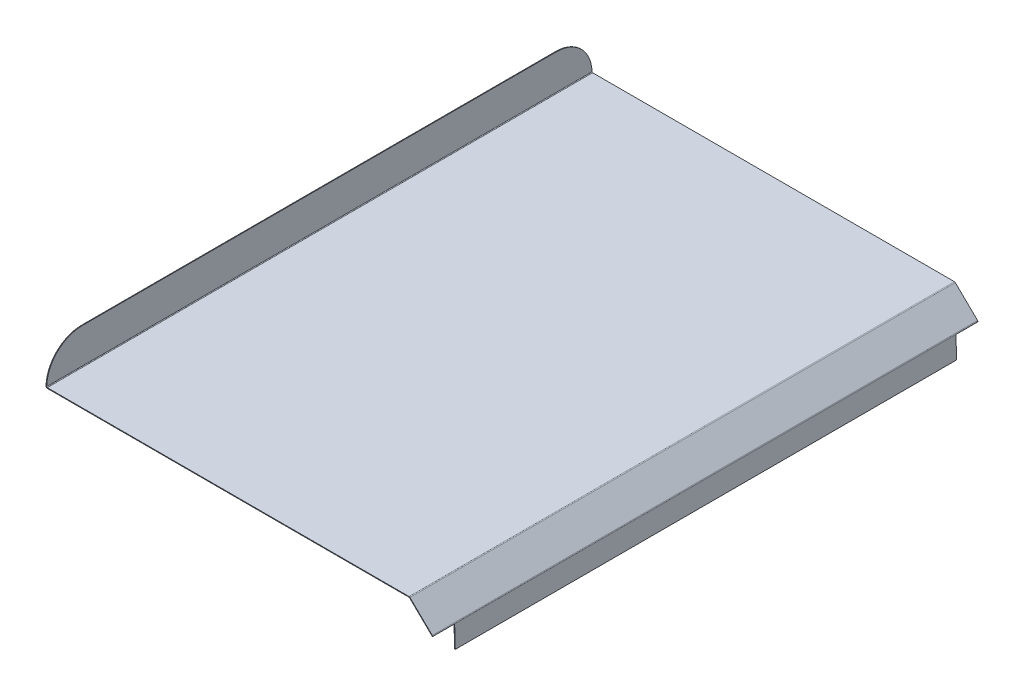
ISO-10303-21;
HEADER;
FILE_DESCRIPTION(('STEP AP214'),'2;1');
FILE_NAME('part.step','',(''),(''),'','','');
FILE_SCHEMA(('AUTOMOTIVE_DESIGN { 1 0 10303 214 1 1 1 1 }'));
ENDSEC;
DATA;
#1=APPLICATION_CONTEXT('core data for automotive mechanical design processes');
#2=APPLICATION_PROTOCOL_DEFINITION('international standard','automotive_design',2000,#1);
#3=PRODUCT_CONTEXT('',#1,'mechanical');
#4=PRODUCT('Part','Part','',(#3));
#5=PRODUCT_RELATED_PRODUCT_CATEGORY('part','',(#4));
#6=PRODUCT_DEFINITION_FORMATION('','',#4);
#7=PRODUCT_DEFINITION_CONTEXT('part definition',#1,'design');
#8=PRODUCT_DEFINITION('design','',#6,#7);
#9=PRODUCT_DEFINITION_SHAPE('','',#8);
#10=(LENGTH_UNIT() NAMED_UNIT(*) SI_UNIT(.MILLI.,.METRE.));
#11=(NAMED_UNIT(*) PLANE_ANGLE_UNIT() SI_UNIT($,.RADIAN.));
#12=(NAMED_UNIT(*) SI_UNIT($,.STERADIAN.) SOLID_ANGLE_UNIT());
#13=UNCERTAINTY_MEASURE_WITH_UNIT(LENGTH_MEASURE(1.E-05),#10,'distance_accuracy_value','');
#14=(GEOMETRIC_REPRESENTATION_CONTEXT(3) GLOBAL_UNCERTAINTY_ASSIGNED_CONTEXT((#13)) GLOBAL_UNIT_ASSIGNED_CONTEXT((#10,
#11,#12)) REPRESENTATION_CONTEXT('',''));
#15=CARTESIAN_POINT('',(0.,0.,0.));
#16=DIRECTION('',(0.,0.,1.));
#17=DIRECTION('',(1.,0.,0.));
#18=AXIS2_PLACEMENT_3D('',#15,#16,#17);
#19=CARTESIAN_POINT('',(-328.2,1.19999999999998,495.));
#20=DIRECTION('',(0.,0.,1.));
#21=DIRECTION('',(-1.,0.,0.));
#22=AXIS2_PLACEMENT_3D('',#19,#20,#21);
#23=CYLINDRICAL_SURFACE('',#22,2.39999999999998);
#24=DIRECTION('',(0.,0.,1.));
#25=VECTOR('',#24,1.);
#26=CARTESIAN_POINT('',(-330.6,1.19999999999997,-495.));
#27=LINE('',#26,#25);
#28=CARTESIAN_POINT('',(-330.6,1.19999999999998,494.984921327951));
#29=VERTEX_POINT('',#28);
#30=CARTESIAN_POINT('',(-330.6,1.19999999999998,-494.984921327951));
#31=VERTEX_POINT('',#30);
#32=EDGE_CURVE('E328',#29,#31,#27,.F.);
#33=ORIENTED_EDGE('',*,*,#32,.T.);
#34=CARTESIAN_POINT('',(-330.149358868962,-0.200000000000452,-495.));
#35=CARTESIAN_POINT('',(-330.188152224646,-0.145994612382155,-495.00000051532));
#36=CARTESIAN_POINT('',(-330.224689392359,-0.090372542458736,-494.999933113919));
#37=CARTESIAN_POINT('',(-330.293010180263,0.0236844314572738,-494.999641138335));
#38=CARTESIAN_POINT('',(-330.324795896014,0.0821180803220112,-494.99941663369));
#39=CARTESIAN_POINT('',(-330.383405695045,0.201422836486057,-494.99878916804));
#40=CARTESIAN_POINT('',(-330.410230054604,0.262293807829672,-494.998386216976));
#41=CARTESIAN_POINT('',(-330.458741767851,0.386052443640968,-494.997387914974));
#42=CARTESIAN_POINT('',(-330.480427382725,0.448940782582197,-494.996792499071));
#43=CARTESIAN_POINT('',(-330.532687469517,0.623807343929943,-494.994871915251));
#44=CARTESIAN_POINT('',(-330.55785807903,0.737471967705745,-494.993333485688));
#45=CARTESIAN_POINT('',(-330.583106648261,0.909821911836267,-494.990544151725));
#46=CARTESIAN_POINT('',(-330.589438340442,0.967678877880878,-494.989531997534));
#47=CARTESIAN_POINT('',(-330.597883546227,1.08368211599575,-494.987347140162));
#48=CARTESIAN_POINT('',(-330.599998133303,1.14182831066331,-494.986174477919));
#49=CARTESIAN_POINT('',(-330.6,1.19999999999996,-494.984921327951));
#50=B_SPLINE_CURVE_WITH_KNOTS('',3,(#34,#35,#36,#37,#38,#39,#40,#41,#42,#43,#44,#45,#46,#47,#48,
#49),.UNSPECIFIED.,.F.,.F.,(4,2,2,2,2,2,2,4),(0.,0.199420084884954,0.398751957205618,
0.598072726091101,0.797460843746302,1.14530797074352,1.31981519785326,1.49427799813874),.UNSPECIFIED.);
#51=CARTESIAN_POINT('',(-330.149358868962,-0.200000000000447,-495.));
#52=VERTEX_POINT('',#51);
#53=EDGE_CURVE('E244',#52,#31,#50,.T.);
#54=ORIENTED_EDGE('',*,*,#53,.F.);
#55=CARTESIAN_POINT('',(-328.2,1.19999999999998,-495.));
#56=DIRECTION('',(0.,0.,1.));
#57=DIRECTION('',(1.,0.,0.));
#58=AXIS2_PLACEMENT_3D('',#55,#56,#57);
#59=CIRCLE('',#58,2.39999999999998);
#60=CARTESIAN_POINT('',(-328.2,-1.2,-495.));
#61=VERTEX_POINT('',#60);
#62=EDGE_CURVE('E254',#61,#52,#59,.F.);
#63=ORIENTED_EDGE('',*,*,#62,.F.);
#64=DIRECTION('',(0.,0.,1.));
#65=VECTOR('',#64,1.);
#66=CARTESIAN_POINT('',(-328.2,-1.2,495.));
#67=LINE('',#66,#65);
#68=CARTESIAN_POINT('',(-328.2,-1.2,495.));
#69=VERTEX_POINT('',#68);
#70=EDGE_CURVE('E263',#69,#61,#67,.F.);
#71=ORIENTED_EDGE('',*,*,#70,.F.);
#72=CARTESIAN_POINT('',(-328.2,1.19999999999998,495.));
#73=DIRECTION('',(0.,0.,1.));
#74=DIRECTION('',(1.,0.,0.));
#75=AXIS2_PLACEMENT_3D('',#72,#73,#74);
#76=CIRCLE('',#75,2.39999999999998);
#77=CARTESIAN_POINT('',(-330.149358868962,-0.200000000000441,495.));
#78=VERTEX_POINT('',#77);
#79=EDGE_CURVE('E261',#78,#69,#76,.T.);
#80=ORIENTED_EDGE('',*,*,#79,.F.);
#81=CARTESIAN_POINT('',(-330.6,1.19999999999998,494.984921327951));
#82=CARTESIAN_POINT('',(-330.600006103981,1.13352077330462,494.9863542015));
#83=CARTESIAN_POINT('',(-330.5972378366,1.06704227170075,494.987682770179));
#84=CARTESIAN_POINT('',(-330.586200934402,0.934569059524371,494.990128963269));
#85=CARTESIAN_POINT('',(-330.577934733903,0.868574147901891,494.991246680758));
#86=CARTESIAN_POINT('',(-330.555951001093,0.737495220337495,494.99327004024));
#87=CARTESIAN_POINT('',(-330.542233834453,0.672411143596449,494.994175696453));
#88=CARTESIAN_POINT('',(-330.509450183755,0.543597387100169,494.995778084175));
#89=CARTESIAN_POINT('',(-330.490381893338,0.479868172529175,494.99647474497));
#90=CARTESIAN_POINT('',(-330.430829111767,0.307346234849572,494.998112807731));
#91=CARTESIAN_POINT('',(-330.384970062602,0.200332049906215,494.998850202995));
#92=CARTESIAN_POINT('',(-330.304934531889,0.0455944984104295,494.999558219176));
#93=CARTESIAN_POINT('',(-330.276324321117,-0.0051004938558113,494.999727827088));
#94=CARTESIAN_POINT('',(-330.21550598387,-0.104266908174387,494.999948718925));
#95=CARTESIAN_POINT('',(-330.183298774212,-0.152738892412896,495.00000003293));
#96=CARTESIAN_POINT('',(-330.149358868962,-0.200000000000442,495.));
#97=B_SPLINE_CURVE_WITH_KNOTS('',3,(#81,#82,#83,#84,#85,#86,#87,#88,#89,#90,#91,#92,#93,#94,#95,
#96),.UNSPECIFIED.,.F.,.F.,(4,2,2,2,2,2,2,4),(0.,0.199420886223096,0.398753533700895,
0.598072811445956,0.797459453775014,1.14530735664841,1.31981488129379,1.49427802783097),.UNSPECIFIED.);
#98=EDGE_CURVE('E353',#29,#78,#97,.T.);
#99=ORIENTED_EDGE('',*,*,#98,.F.);
#100=EDGE_LOOP('',(#33,#54,#63,#71,#80,#99));
#101=FACE_BOUND('',#100,.T.);
#102=ADVANCED_FACE('F94',(#101),#23,.T.);
#103=CARTESIAN_POINT('',(-328.2,1.19999999999998,495.));
#104=DIRECTION('',(0.,0.,1.));
#105=DIRECTION('',(-1.,0.,0.));
#106=AXIS2_PLACEMENT_3D('',#103,#104,#105);
#107=CYLINDRICAL_SURFACE('',#106,1.19999999999998);
#108=CARTESIAN_POINT('',(-329.174679434481,0.499999999999772,-495.));
#109=CARTESIAN_POINT('',(-329.204194187572,0.541059076502178,-495.000004717784));
#110=CARTESIAN_POINT('',(-329.23108470351,0.584015595812634,-494.999846051145));
#111=CARTESIAN_POINT('',(-329.279215613719,0.672904084592748,-494.999140979918));
#112=CARTESIAN_POINT('',(-329.30046396359,0.718831749724892,-494.998595125308));
#113=CARTESIAN_POINT('',(-329.331895833201,0.799825207356062,-494.997270024838));
#114=CARTESIAN_POINT('',(-329.343512326663,0.834344156943986,-494.996598466955));
#115=CARTESIAN_POINT('',(-329.363561242081,0.904284881448329,-494.995006035581));
#116=CARTESIAN_POINT('',(-329.371994333351,0.939706464911099,-494.994085214566));
#117=CARTESIAN_POINT('',(-329.385845760382,1.01241890527458,-494.991955450844));
#118=CARTESIAN_POINT('',(-329.391147652298,1.04973169334227,-494.990737514893));
#119=CARTESIAN_POINT('',(-329.39822842573,1.12469800406108,-494.98803180459));
#120=CARTESIAN_POINT('',(-329.400005648319,1.16235167878313,-494.986543903535));
#121=CARTESIAN_POINT('',(-329.4,1.19999999999997,-494.984921327951));
#122=B_SPLINE_CURVE_WITH_KNOTS('',3,(#108,#109,#110,#111,#112,#113,#114,#115,#116,#117,#118,
#119,#120,#121),.UNSPECIFIED.,.F.,.F.,(4,2,2,2,2,2,4),(0.,0.151619829028227,0.303024721082457,
0.41216458823387,0.521281495794662,0.634235553812835,0.747242762353978),.UNSPECIFIED.);
#123=CARTESIAN_POINT('',(-329.174679434481,0.499999999999774,-495.));
#124=VERTEX_POINT('',#123);
#125=CARTESIAN_POINT('',(-329.4,1.19999999999998,-494.984921327951));
#126=VERTEX_POINT('',#125);
#127=EDGE_CURVE('E234',#124,#126,#122,.T.);
#128=ORIENTED_EDGE('',*,*,#127,.T.);
#129=DIRECTION('',(0.,0.,1.));
#130=VECTOR('',#129,1.);
#131=CARTESIAN_POINT('',(-329.4,1.19999999999998,-495.));
#132=LINE('',#131,#130);
#133=CARTESIAN_POINT('',(-329.4,1.19999999999998,494.984921327951));
#134=VERTEX_POINT('',#133);
#135=EDGE_CURVE('E321',#126,#134,#132,.T.);
#136=ORIENTED_EDGE('',*,*,#135,.T.);
#137=CARTESIAN_POINT('',(-329.4,1.19999999999998,494.984921327951));
#138=CARTESIAN_POINT('',(-329.400021812654,1.14948067671394,494.987101843831));
#139=CARTESIAN_POINT('',(-329.396811049994,1.09894030739966,494.989037973418));
#140=CARTESIAN_POINT('',(-329.384068997299,0.99871841772667,494.992420409634));
#141=CARTESIAN_POINT('',(-329.374546680093,0.949035780706017,494.993867407233));
#142=CARTESIAN_POINT('',(-329.352845681613,0.864926216815821,494.995940428816));
#143=CARTESIAN_POINT('',(-329.34215054978,0.830112166486433,494.996682870701));
#144=CARTESIAN_POINT('',(-329.317643483625,0.761598945155232,494.997930995698));
#145=CARTESIAN_POINT('',(-329.303832204645,0.727899541443378,494.998436728522));
#146=CARTESIAN_POINT('',(-329.272664163058,0.660732496606014,494.999242640754));
#147=CARTESIAN_POINT('',(-329.255199803243,0.62731467630513,494.999534966593));
#148=CARTESIAN_POINT('',(-329.21720140195,0.562250175342996,494.999914242113));
#149=CARTESIAN_POINT('',(-329.196665920952,0.530604334869636,495.000001095161));
#150=CARTESIAN_POINT('',(-329.174679434481,0.499999999999775,495.));
#151=B_SPLINE_CURVE_WITH_KNOTS('',3,(#137,#138,#139,#140,#141,#142,#143,#144,#145,#146,#147,
#148,#149,#150),.UNSPECIFIED.,.F.,.F.,(4,2,2,2,2,2,4),(0.,0.151619727540044,0.303024365730001,
0.412164370956287,0.521281444810483,0.634235577711788,0.74724282225743),.UNSPECIFIED.);
#152=CARTESIAN_POINT('',(-329.174679434481,0.499999999999778,495.));
#153=VERTEX_POINT('',#152);
#154=EDGE_CURVE('E350',#134,#153,#151,.T.);
#155=ORIENTED_EDGE('',*,*,#154,.T.);
#156=CARTESIAN_POINT('',(-328.2,1.19999999999998,495.));
#157=DIRECTION('',(0.,0.,1.));
#158=DIRECTION('',(1.,0.,0.));
#159=AXIS2_PLACEMENT_3D('',#156,#157,#158);
#160=CIRCLE('',#159,1.19999999999998);
#161=CARTESIAN_POINT('',(-328.2,0.,495.));
#162=VERTEX_POINT('',#161);
#163=EDGE_CURVE('E265',#153,#162,#160,.T.);
#164=ORIENTED_EDGE('',*,*,#163,.T.);
#165=DIRECTION('',(0.,0.,1.));
#166=VECTOR('',#165,1.);
#167=CARTESIAN_POINT('',(-328.2,0.,495.));
#168=LINE('',#167,#166);
#169=CARTESIAN_POINT('',(-328.2,0.,-495.));
#170=VERTEX_POINT('',#169);
#171=EDGE_CURVE('E260',#162,#170,#168,.F.);
#172=ORIENTED_EDGE('',*,*,#171,.T.);
#173=CARTESIAN_POINT('',(-328.2,1.19999999999998,-495.));
#174=DIRECTION('',(0.,0.,1.));
#175=DIRECTION('',(1.,0.,0.));
#176=AXIS2_PLACEMENT_3D('',#173,#174,#175);
#177=CIRCLE('',#176,1.19999999999998);
#178=EDGE_CURVE('E251',#170,#124,#177,.F.);
#179=ORIENTED_EDGE('',*,*,#178,.T.);
#180=EDGE_LOOP('',(#128,#136,#155,#164,#172,#179));
#181=FACE_BOUND('',#180,.T.);
#182=ADVANCED_FACE('F258',(#181),#107,.F.);
#183=CARTESIAN_POINT('',(-330.6,64.8,-495.));
#184=DIRECTION('',(1.,0.,0.));
#185=DIRECTION('',(0.,1.,0.));
#186=AXIS2_PLACEMENT_3D('',#183,#184,#185);
#187=PLANE('',#186);
#188=CARTESIAN_POINT('',(-330.6,-0.200000000000001,-430.));
#189=DIRECTION('',(1.,0.,0.));
#190=DIRECTION('',(0.,1.,0.));
#191=AXIS2_PLACEMENT_3D('',#188,#189,#190);
#192=CIRCLE('',#191,65.);
#193=CARTESIAN_POINT('',(-330.6,64.8,-430.));
#194=VERTEX_POINT('',#193);
#195=EDGE_CURVE('E111',#31,#194,#192,.T.);
#196=ORIENTED_EDGE('',*,*,#195,.F.);
#197=ORIENTED_EDGE('',*,*,#32,.F.);
#198=CARTESIAN_POINT('',(-330.6,-0.200000000000001,430.));
#199=DIRECTION('',(1.,0.,0.));
#200=DIRECTION('',(0.,1.,0.));
#201=AXIS2_PLACEMENT_3D('',#198,#199,#200);
#202=CIRCLE('',#201,65.);
#203=CARTESIAN_POINT('',(-330.6,64.8,430.));
#204=VERTEX_POINT('',#203);
#205=EDGE_CURVE('E349',#204,#29,#202,.T.);
#206=ORIENTED_EDGE('',*,*,#205,.F.);
#207=DIRECTION('',(0.,0.,-1.));
#208=VECTOR('',#207,1.);
#209=CARTESIAN_POINT('',(-330.6,64.8,-495.));
#210=LINE('',#209,#208);
#211=EDGE_CURVE('E270',#204,#194,#210,.T.);
#212=ORIENTED_EDGE('',*,*,#211,.T.);
#213=EDGE_LOOP('',(#196,#197,#206,#212));
#214=FACE_BOUND('',#213,.T.);
#215=ADVANCED_FACE('F409',(#214),#187,.F.);
#216=CARTESIAN_POINT('',(-329.4,64.8,-495.));
#217=DIRECTION('',(1.,0.,0.));
#218=DIRECTION('',(0.,1.,0.));
#219=AXIS2_PLACEMENT_3D('',#216,#217,#218);
#220=PLANE('',#219);
#221=ORIENTED_EDGE('',*,*,#135,.F.);
#222=CARTESIAN_POINT('',(-329.4,-0.199999999999996,-430.));
#223=DIRECTION('',(1.,0.,0.));
#224=DIRECTION('',(0.,-1.,0.));
#225=AXIS2_PLACEMENT_3D('',#222,#223,#224);
#226=CIRCLE('',#225,65.);
#227=CARTESIAN_POINT('',(-329.4,64.8,-430.));
#228=VERTEX_POINT('',#227);
#229=EDGE_CURVE('E255',#126,#228,#226,.T.);
#230=ORIENTED_EDGE('',*,*,#229,.T.);
#231=DIRECTION('',(0.,0.,1.));
#232=VECTOR('',#231,1.);
#233=CARTESIAN_POINT('',(-329.4,64.8,-495.));
#234=LINE('',#233,#232);
#235=CARTESIAN_POINT('',(-329.4,64.8,430.));
#236=VERTEX_POINT('',#235);
#237=EDGE_CURVE('E325',#236,#228,#234,.F.);
#238=ORIENTED_EDGE('',*,*,#237,.F.);
#239=CARTESIAN_POINT('',(-329.4,-0.199999999999996,430.));
#240=DIRECTION('',(1.,0.,0.));
#241=DIRECTION('',(0.,1.,0.));
#242=AXIS2_PLACEMENT_3D('',#239,#240,#241);
#243=CIRCLE('',#242,65.);
#244=EDGE_CURVE('E119',#236,#134,#243,.T.);
#245=ORIENTED_EDGE('',*,*,#244,.T.);
#246=EDGE_LOOP('',(#221,#230,#238,#245));
#247=FACE_BOUND('',#246,.T.);
#248=ADVANCED_FACE('F576',(#247),#220,.T.);
#249=CARTESIAN_POINT('',(-330.6,64.8,-495.));
#250=DIRECTION('',(0.,-1.,0.));
#251=DIRECTION('',(1.,0.,0.));
#252=AXIS2_PLACEMENT_3D('',#249,#250,#251);
#253=PLANE('',#252);
#254=DIRECTION('',(1.,0.,0.));
#255=VECTOR('',#254,1.);
#256=CARTESIAN_POINT('',(-329.4,64.8,-430.));
#257=LINE('',#256,#255);
#258=EDGE_CURVE('E356',#228,#194,#257,.F.);
#259=ORIENTED_EDGE('',*,*,#258,.T.);
#260=ORIENTED_EDGE('',*,*,#211,.F.);
#261=DIRECTION('',(-1.,0.,0.));
#262=VECTOR('',#261,1.);
#263=CARTESIAN_POINT('',(-330.6,64.8,430.));
#264=LINE('',#263,#262);
#265=EDGE_CURVE('E414',#204,#236,#264,.F.);
#266=ORIENTED_EDGE('',*,*,#265,.T.);
#267=ORIENTED_EDGE('',*,*,#237,.T.);
#268=EDGE_LOOP('',(#259,#260,#266,#267));
#269=FACE_BOUND('',#268,.T.);
#270=ADVANCED_FACE('F405',(#269),#253,.F.);
#271=CARTESIAN_POINT('',(371.240924297367,-41.167260258843,495.));
#272=DIRECTION('',(0.999590378461893,0.0286194913723045,0.));
#273=DIRECTION('',(-0.0286194913723045,0.999590378461893,0.));
#274=AXIS2_PLACEMENT_3D('',#271,#272,#273);
#275=PLANE('',#274);
#276=DIRECTION('',(0.,0.,1.));
#277=VECTOR('',#276,1.);
#278=CARTESIAN_POINT('',(371.254862719912,-41.6540862783923,495.));
#279=LINE('',#278,#277);
#280=CARTESIAN_POINT('',(371.254862719912,-41.6540862783923,-455.));
#281=VERTEX_POINT('',#280);
#282=CARTESIAN_POINT('',(371.254862719912,-41.6540862783923,455.));
#283=VERTEX_POINT('',#282);
#284=EDGE_CURVE('E454',#281,#283,#279,.T.);
#285=ORIENTED_EDGE('',*,*,#284,.T.);
#286=DIRECTION('',(-0.0286194913723046,0.999590378461893,0.));
#287=VECTOR('',#286,1.);
#288=CARTESIAN_POINT('',(372.38570395226,-81.1508753973188,455.));
#289=LINE('',#288,#287);
#290=CARTESIAN_POINT('',(372.385703952259,-81.1508753973188,455.));
#291=VERTEX_POINT('',#290);
#292=EDGE_CURVE('E416',#291,#283,#289,.T.);
#293=ORIENTED_EDGE('',*,*,#292,.F.);
#294=DIRECTION('',(0.,0.,1.));
#295=VECTOR('',#294,1.);
#296=CARTESIAN_POINT('',(372.385703952259,-81.1508753973188,495.));
#297=LINE('',#296,#295);
#298=CARTESIAN_POINT('',(372.385703952259,-81.1508753973188,-455.));
#299=VERTEX_POINT('',#298);
#300=EDGE_CURVE('E445',#299,#291,#297,.T.);
#301=ORIENTED_EDGE('',*,*,#300,.F.);
#302=DIRECTION('',(0.0286194913723046,-0.999590378461893,0.));
#303=VECTOR('',#302,1.);
#304=CARTESIAN_POINT('',(372.38570395226,-81.1508753973188,-455.));
#305=LINE('',#304,#303);
#306=EDGE_CURVE('E432',#281,#299,#305,.T.);
#307=ORIENTED_EDGE('',*,*,#306,.F.);
#308=EDGE_LOOP('',(#285,#293,#301,#307));
#309=FACE_BOUND('',#308,.T.);
#310=ADVANCED_FACE('F582',(#309),#275,.T.);
#311=CARTESIAN_POINT('',(370.041415843213,-41.2016036484898,495.));
#312=DIRECTION('',(0.999590378461893,0.0286194913723045,0.));
#313=DIRECTION('',(-0.0286194913723045,0.999590378461893,0.));
#314=AXIS2_PLACEMENT_3D('',#311,#312,#313);
#315=PLANE('',#314);
#316=DIRECTION('',(-0.0286194913723045,0.999590378461893,0.));
#317=VECTOR('',#316,1.);
#318=CARTESIAN_POINT('',(370.041415843213,-41.2016036484898,455.));
#319=LINE('',#318,#317);
#320=CARTESIAN_POINT('',(371.186195498105,-81.1852187869655,455.));
#321=VERTEX_POINT('',#320);
#322=CARTESIAN_POINT('',(370.055354265757,-41.688429668039,455.));
#323=VERTEX_POINT('',#322);
#324=EDGE_CURVE('E423',#321,#323,#319,.T.);
#325=ORIENTED_EDGE('',*,*,#324,.T.);
#326=DIRECTION('',(0.,0.,-1.));
#327=VECTOR('',#326,1.);
#328=CARTESIAN_POINT('',(370.055354265757,-41.688429668039,-495.));
#329=LINE('',#328,#327);
#330=CARTESIAN_POINT('',(370.055354265757,-41.688429668039,-455.000000000001));
#331=VERTEX_POINT('',#330);
#332=EDGE_CURVE('E461',#331,#323,#329,.F.);
#333=ORIENTED_EDGE('',*,*,#332,.F.);
#334=DIRECTION('',(-0.0286194913723045,0.999590378461893,0.));
#335=VECTOR('',#334,1.);
#336=CARTESIAN_POINT('',(370.041415843213,-41.2016036484898,-455.000000000001));
#337=LINE('',#336,#335);
#338=CARTESIAN_POINT('',(371.186195498105,-81.1852187869655,-455.000000000001));
#339=VERTEX_POINT('',#338);
#340=EDGE_CURVE('E435',#331,#339,#337,.F.);
#341=ORIENTED_EDGE('',*,*,#340,.T.);
#342=DIRECTION('',(0.,0.,-1.));
#343=VECTOR('',#342,1.);
#344=CARTESIAN_POINT('',(371.186195498105,-81.1852187869655,495.));
#345=LINE('',#344,#343);
#346=EDGE_CURVE('E449',#339,#321,#345,.F.);
#347=ORIENTED_EDGE('',*,*,#346,.T.);
#348=EDGE_LOOP('',(#325,#333,#341,#347));
#349=FACE_BOUND('',#348,.T.);
#350=ADVANCED_FACE('F586',(#349),#315,.F.);
#351=CARTESIAN_POINT('',(372.385703952259,-81.1508753973188,495.));
#352=DIRECTION('',(0.0286194913723052,-0.999590378461893,0.));
#353=DIRECTION('',(0.999590378461893,0.0286194913723052,0.));
#354=AXIS2_PLACEMENT_3D('',#351,#352,#353);
#355=PLANE('',#354);
#356=ORIENTED_EDGE('',*,*,#300,.T.);
#357=DIRECTION('',(0.999590378461893,0.0286194913723045,0.));
#358=VECTOR('',#357,1.);
#359=CARTESIAN_POINT('',(372.385703952259,-81.1508753973188,455.));
#360=LINE('',#359,#358);
#361=EDGE_CURVE('E422',#291,#321,#360,.F.);
#362=ORIENTED_EDGE('',*,*,#361,.T.);
#363=ORIENTED_EDGE('',*,*,#346,.F.);
#364=DIRECTION('',(0.999590378461893,0.0286194913723045,0.));
#365=VECTOR('',#364,1.);
#366=CARTESIAN_POINT('',(372.385703952259,-81.1508753973188,-455.));
#367=LINE('',#366,#365);
#368=EDGE_CURVE('E440',#299,#339,#367,.F.);
#369=ORIENTED_EDGE('',*,*,#368,.F.);
#370=EDGE_LOOP('',(#356,#362,#363,#369));
#371=FACE_BOUND('',#370,.T.);
#372=ADVANCED_FACE('F563',(#371),#355,.T.);
#373=CARTESIAN_POINT('',(329.71442304748,-0.33941529540196,495.));
#374=DIRECTION('',(0.,0.,1.));
#375=DIRECTION('',(1.,0.,0.));
#376=AXIS2_PLACEMENT_3D('',#373,#374,#375);
#377=PLANE('',#376);
#378=DIRECTION('',(0.717153920498349,-0.696914811374997,0.));
#379=VECTOR('',#378,1.);
#380=CARTESIAN_POINT('',(328.87812527383,-1.19999999999998,495.));
#381=LINE('',#380,#379);
#382=CARTESIAN_POINT('',(369.692143585253,-40.8621883530878,495.));
#383=VERTEX_POINT('',#382);
#384=CARTESIAN_POINT('',(329.22739753179,-1.53941529540198,495.));
#385=VERTEX_POINT('',#384);
#386=EDGE_CURVE('E490',#383,#385,#381,.F.);
#387=ORIENTED_EDGE('',*,*,#386,.F.);
#388=DIRECTION('',(0.696914811375005,0.717153920498342,0.));
#389=VECTOR('',#388,1.);
#390=CARTESIAN_POINT('',(369.692143585253,-40.8621883530878,495.));
#391=LINE('',#390,#389);
#392=CARTESIAN_POINT('',(370.528441358903,-40.0016036484897,495.));
#393=VERTEX_POINT('',#392);
#394=EDGE_CURVE('E470',#383,#393,#391,.T.);
#395=ORIENTED_EDGE('',*,*,#394,.T.);
#396=DIRECTION('',(-0.717153920498349,0.696914811374997,0.));
#397=VECTOR('',#396,1.);
#398=CARTESIAN_POINT('',(329.71442304748,-0.33941529540196,495.));
#399=LINE('',#398,#397);
#400=CARTESIAN_POINT('',(330.06369530544,-0.678830590803946,495.));
#401=VERTEX_POINT('',#400);
#402=EDGE_CURVE('E320',#393,#401,#399,.T.);
#403=ORIENTED_EDGE('',*,*,#402,.T.);
#404=DIRECTION('',(0.696914811374997,0.717153920498349,0.));
#405=VECTOR('',#404,1.);
#406=CARTESIAN_POINT('',(329.22739753179,-1.539415295402,495.));
#407=LINE('',#406,#405);
#408=EDGE_CURVE('E307',#385,#401,#407,.T.);
#409=ORIENTED_EDGE('',*,*,#408,.F.);
#410=EDGE_LOOP('',(#387,#395,#403,#409));
#411=FACE_BOUND('',#410,.T.);
#412=ADVANCED_FACE('F522',(#411),#377,.T.);
#413=CARTESIAN_POINT('',(329.71442304748,-0.33941529540196,495.));
#414=DIRECTION('',(0.696914811374997,0.717153920498349,0.));
#415=DIRECTION('',(-0.717153920498349,0.696914811374997,0.));
#416=AXIS2_PLACEMENT_3D('',#413,#414,#415);
#417=PLANE('',#416);
#418=ORIENTED_EDGE('',*,*,#402,.F.);
#419=DIRECTION('',(0.,0.,1.));
#420=VECTOR('',#419,1.);
#421=CARTESIAN_POINT('',(370.528441358903,-40.0016036484897,495.));
#422=LINE('',#421,#420);
#423=CARTESIAN_POINT('',(370.528441358903,-40.0016036484898,-495.));
#424=VERTEX_POINT('',#423);
#425=EDGE_CURVE('E463',#393,#424,#422,.F.);
#426=ORIENTED_EDGE('',*,*,#425,.T.);
#427=DIRECTION('',(0.717153920498349,-0.696914811374997,0.));
#428=VECTOR('',#427,1.);
#429=CARTESIAN_POINT('',(372.112562827343,-41.5410189438918,-495.));
#430=LINE('',#429,#428);
#431=CARTESIAN_POINT('',(330.06369530544,-0.678830590803956,-495.));
#432=VERTEX_POINT('',#431);
#433=EDGE_CURVE('E487',#432,#424,#430,.T.);
#434=ORIENTED_EDGE('',*,*,#433,.F.);
#435=DIRECTION('',(0.,0.,1.));
#436=VECTOR('',#435,1.);
#437=CARTESIAN_POINT('',(330.06369530544,-0.678830590803946,495.));
#438=LINE('',#437,#436);
#439=EDGE_CURVE('E495',#432,#401,#438,.T.);
#440=ORIENTED_EDGE('',*,*,#439,.T.);
#441=EDGE_LOOP('',(#418,#426,#434,#440));
#442=FACE_BOUND('',#441,.T.);
#443=ADVANCED_FACE('F511',(#442),#417,.T.);
#444=CARTESIAN_POINT('',(328.87812527383,-1.19999999999998,495.));
#445=DIRECTION('',(0.696914811374997,0.717153920498349,0.));
#446=DIRECTION('',(-0.717153920498349,0.696914811374997,0.));
#447=AXIS2_PLACEMENT_3D('',#444,#445,#446);
#448=PLANE('',#447);
#449=DIRECTION('',(0.,0.,1.));
#450=VECTOR('',#449,1.);
#451=CARTESIAN_POINT('',(369.692143585253,-40.8621883530878,495.));
#452=LINE('',#451,#450);
#453=CARTESIAN_POINT('',(369.692143585253,-40.8621883530878,-495.));
#454=VERTEX_POINT('',#453);
#455=EDGE_CURVE('E476',#383,#454,#452,.F.);
#456=ORIENTED_EDGE('',*,*,#455,.F.);
#457=ORIENTED_EDGE('',*,*,#386,.T.);
#458=DIRECTION('',(0.,0.,-1.));
#459=VECTOR('',#458,1.);
#460=CARTESIAN_POINT('',(329.22739753179,-1.53941529540198,-495.));
#461=LINE('',#460,#459);
#462=CARTESIAN_POINT('',(329.22739753179,-1.53941529540198,-495.));
#463=VERTEX_POINT('',#462);
#464=EDGE_CURVE('E498',#463,#385,#461,.F.);
#465=ORIENTED_EDGE('',*,*,#464,.F.);
#466=DIRECTION('',(-0.717153920498349,0.696914811374997,0.));
#467=VECTOR('',#466,1.);
#468=CARTESIAN_POINT('',(328.87812527383,-1.19999999999998,-495.));
#469=LINE('',#468,#467);
#470=EDGE_CURVE('E492',#463,#454,#469,.F.);
#471=ORIENTED_EDGE('',*,*,#470,.T.);
#472=EDGE_LOOP('',(#456,#457,#465,#471));
#473=FACE_BOUND('',#472,.T.);
#474=ADVANCED_FACE('F526',(#473),#448,.F.);
#475=CARTESIAN_POINT('',(-330.6,-1.2,495.));
#476=DIRECTION('',(0.,0.,1.));
#477=DIRECTION('',(1.,0.,0.));
#478=AXIS2_PLACEMENT_3D('',#475,#476,#477);
#479=PLANE('',#478);
#480=DIRECTION('',(1.,0.,0.));
#481=VECTOR('',#480,1.);
#482=CARTESIAN_POINT('',(-330.6,-1.2,495.));
#483=LINE('',#482,#481);
#484=CARTESIAN_POINT('',(328.39109975814,-1.2,495.));
#485=VERTEX_POINT('',#484);
#486=EDGE_CURVE('E13',#69,#485,#483,.T.);
#487=ORIENTED_EDGE('',*,*,#486,.T.);
#488=DIRECTION('',(0.,1.,0.));
#489=VECTOR('',#488,1.);
#490=CARTESIAN_POINT('',(328.39109975814,-1.19999999999999,495.));
#491=LINE('',#490,#489);
#492=CARTESIAN_POINT('',(328.39109975814,0.,495.));
#493=VERTEX_POINT('',#492);
#494=EDGE_CURVE('E287',#485,#493,#491,.T.);
#495=ORIENTED_EDGE('',*,*,#494,.T.);
#496=DIRECTION('',(1.,0.,0.));
#497=VECTOR('',#496,1.);
#498=CARTESIAN_POINT('',(-330.6,0.,495.));
#499=LINE('',#498,#497);
#500=EDGE_CURVE('E98',#162,#493,#499,.T.);
#501=ORIENTED_EDGE('',*,*,#500,.F.);
#502=DIRECTION('',(0.,-1.,0.));
#503=VECTOR('',#502,1.);
#504=CARTESIAN_POINT('',(-328.2,0.,495.));
#505=LINE('',#504,#503);
#506=EDGE_CURVE('E274',#162,#69,#505,.T.);
#507=ORIENTED_EDGE('',*,*,#506,.T.);
#508=EDGE_LOOP('',(#487,#495,#501,#507));
#509=FACE_BOUND('',#508,.T.);
#510=ADVANCED_FACE('F288',(#509),#479,.T.);
#511=CARTESIAN_POINT('',(330.6,-1.2,-495.));
#512=DIRECTION('',(0.,-1.,0.));
#513=DIRECTION('',(0.,0.,-1.));
#514=AXIS2_PLACEMENT_3D('',#511,#512,#513);
#515=PLANE('',#514);
#516=DIRECTION('',(-1.,0.,0.));
#517=VECTOR('',#516,1.);
#518=CARTESIAN_POINT('',(-330.6,-1.2,-495.));
#519=LINE('',#518,#517);
#520=CARTESIAN_POINT('',(328.39109975814,-1.2,-495.));
#521=VERTEX_POINT('',#520);
#522=EDGE_CURVE('E103',#521,#61,#519,.T.);
#523=ORIENTED_EDGE('',*,*,#522,.F.);
#524=DIRECTION('',(0.,0.,1.));
#525=VECTOR('',#524,1.);
#526=CARTESIAN_POINT('',(328.39109975814,-1.19999999999999,495.));
#527=LINE('',#526,#525);
#528=EDGE_CURVE('E312',#485,#521,#527,.F.);
#529=ORIENTED_EDGE('',*,*,#528,.F.);
#530=ORIENTED_EDGE('',*,*,#486,.F.);
#531=ORIENTED_EDGE('',*,*,#70,.T.);
#532=EDGE_LOOP('',(#523,#529,#530,#531));
#533=FACE_BOUND('',#532,.T.);
#534=ADVANCED_FACE('F336',(#533),#515,.T.);
#535=CARTESIAN_POINT('',(330.6,0.,-495.));
#536=DIRECTION('',(0.,-1.,0.));
#537=DIRECTION('',(0.,0.,-1.));
#538=AXIS2_PLACEMENT_3D('',#535,#536,#537);
#539=PLANE('',#538);
#540=DIRECTION('',(0.,0.,1.));
#541=VECTOR('',#540,1.);
#542=CARTESIAN_POINT('',(328.39109975814,0.,495.));
#543=LINE('',#542,#541);
#544=CARTESIAN_POINT('',(328.39109975814,0.,-495.));
#545=VERTEX_POINT('',#544);
#546=EDGE_CURVE('E283',#493,#545,#543,.F.);
#547=ORIENTED_EDGE('',*,*,#546,.T.);
#548=DIRECTION('',(-1.,0.,0.));
#549=VECTOR('',#548,1.);
#550=CARTESIAN_POINT('',(-330.6,0.,-495.));
#551=LINE('',#550,#549);
#552=EDGE_CURVE('E273',#545,#170,#551,.T.);
#553=ORIENTED_EDGE('',*,*,#552,.T.);
#554=ORIENTED_EDGE('',*,*,#171,.F.);
#555=ORIENTED_EDGE('',*,*,#500,.T.);
#556=EDGE_LOOP('',(#547,#553,#554,#555));
#557=FACE_BOUND('',#556,.T.);
#558=ADVANCED_FACE('F281',(#557),#539,.F.);
#559=CARTESIAN_POINT('',(-330.6,-1.2,-495.));
#560=DIRECTION('',(0.,0.,-1.));
#561=DIRECTION('',(-1.,0.,0.));
#562=AXIS2_PLACEMENT_3D('',#559,#560,#561);
#563=PLANE('',#562);
#564=DIRECTION('',(0.,1.,0.));
#565=VECTOR('',#564,1.);
#566=CARTESIAN_POINT('',(328.39109975814,-1.19999999999999,-495.));
#567=LINE('',#566,#565);
#568=EDGE_CURVE('E294',#521,#545,#567,.T.);
#569=ORIENTED_EDGE('',*,*,#568,.F.);
#570=ORIENTED_EDGE('',*,*,#522,.T.);
#571=DIRECTION('',(0.,-1.,0.));
#572=VECTOR('',#571,1.);
#573=CARTESIAN_POINT('',(-328.2,0.,-495.));
#574=LINE('',#573,#572);
#575=EDGE_CURVE('E271',#170,#61,#574,.T.);
#576=ORIENTED_EDGE('',*,*,#575,.F.);
#577=ORIENTED_EDGE('',*,*,#552,.F.);
#578=EDGE_LOOP('',(#569,#570,#576,#577));
#579=FACE_BOUND('',#578,.T.);
#580=ADVANCED_FACE('F96',(#579),#563,.T.);
#581=CARTESIAN_POINT('',(-328.2,1.19999999999998,-495.));
#582=DIRECTION('',(0.,0.,-1.));
#583=DIRECTION('',(-1.,0.,0.));
#584=AXIS2_PLACEMENT_3D('',#581,#582,#583);
#585=PLANE('',#584);
#586=DIRECTION('',(0.812232862067283,0.583333333333515,0.));
#587=VECTOR('',#586,1.);
#588=CARTESIAN_POINT('',(-330.149358868962,-0.200000000000449,-495.));
#589=LINE('',#588,#587);
#590=EDGE_CURVE('E237',#52,#124,#589,.T.);
#591=ORIENTED_EDGE('',*,*,#590,.T.);
#592=ORIENTED_EDGE('',*,*,#178,.F.);
#593=ORIENTED_EDGE('',*,*,#575,.T.);
#594=ORIENTED_EDGE('',*,*,#62,.T.);
#595=EDGE_LOOP('',(#591,#592,#593,#594));
#596=FACE_BOUND('',#595,.T.);
#597=ADVANCED_FACE('F249',(#596),#585,.T.);
#598=CARTESIAN_POINT('',(-328.2,1.19999999999998,495.));
#599=DIRECTION('',(0.,0.,-1.));
#600=DIRECTION('',(-1.,0.,0.));
#601=AXIS2_PLACEMENT_3D('',#598,#599,#600);
#602=PLANE('',#601);
#603=DIRECTION('',(-0.812232862067284,-0.583333333333513,0.));
#604=VECTOR('',#603,1.);
#605=CARTESIAN_POINT('',(-329.174679434481,0.499999999999789,495.));
#606=LINE('',#605,#604);
#607=EDGE_CURVE('E345',#78,#153,#606,.F.);
#608=ORIENTED_EDGE('',*,*,#607,.F.);
#609=ORIENTED_EDGE('',*,*,#79,.T.);
#610=ORIENTED_EDGE('',*,*,#506,.F.);
#611=ORIENTED_EDGE('',*,*,#163,.F.);
#612=EDGE_LOOP('',(#608,#609,#610,#611));
#613=FACE_BOUND('',#612,.T.);
#614=ADVANCED_FACE('F344',(#613),#602,.F.);
#615=CARTESIAN_POINT('',(328.39109975814,-2.40000000000002,-495.));
#616=DIRECTION('',(0.,0.,-1.));
#617=DIRECTION('',(-1.,0.,0.));
#618=AXIS2_PLACEMENT_3D('',#615,#616,#617);
#619=PLANE('',#618);
#620=DIRECTION('',(0.696914811374997,0.717153920498349,0.));
#621=VECTOR('',#620,1.);
#622=CARTESIAN_POINT('',(330.06369530544,-0.678830590803946,-495.));
#623=LINE('',#622,#621);
#624=EDGE_CURVE('E483',#463,#432,#623,.T.);
#625=ORIENTED_EDGE('',*,*,#624,.F.);
#626=CARTESIAN_POINT('',(328.39109975814,-2.40000000000002,-495.));
#627=DIRECTION('',(0.,0.,1.));
#628=DIRECTION('',(1.,0.,0.));
#629=AXIS2_PLACEMENT_3D('',#626,#627,#628);
#630=CIRCLE('',#629,1.20000000000003);
#631=EDGE_CURVE('E309',#521,#463,#630,.F.);
#632=ORIENTED_EDGE('',*,*,#631,.F.);
#633=ORIENTED_EDGE('',*,*,#568,.T.);
#634=CARTESIAN_POINT('',(328.39109975814,-2.40000000000002,-495.));
#635=DIRECTION('',(0.,0.,1.));
#636=DIRECTION('',(1.,0.,0.));
#637=AXIS2_PLACEMENT_3D('',#634,#635,#636);
#638=CIRCLE('',#637,2.40000000000003);
#639=EDGE_CURVE('E295',#545,#432,#638,.F.);
#640=ORIENTED_EDGE('',*,*,#639,.T.);
#641=EDGE_LOOP('',(#625,#632,#633,#640));
#642=FACE_BOUND('',#641,.T.);
#643=ADVANCED_FACE('F529',(#642),#619,.T.);
#644=CARTESIAN_POINT('',(328.39109975814,-2.40000000000002,495.));
#645=DIRECTION('',(0.,0.,-1.));
#646=DIRECTION('',(-1.,0.,0.));
#647=AXIS2_PLACEMENT_3D('',#644,#645,#646);
#648=PLANE('',#647);
#649=CARTESIAN_POINT('',(328.39109975814,-2.40000000000002,495.));
#650=DIRECTION('',(0.,0.,1.));
#651=DIRECTION('',(1.,0.,0.));
#652=AXIS2_PLACEMENT_3D('',#649,#650,#651);
#653=CIRCLE('',#652,1.20000000000003);
#654=EDGE_CURVE('E318',#385,#485,#653,.T.);
#655=ORIENTED_EDGE('',*,*,#654,.F.);
#656=ORIENTED_EDGE('',*,*,#408,.T.);
#657=CARTESIAN_POINT('',(328.39109975814,-2.40000000000002,495.));
#658=DIRECTION('',(0.,0.,1.));
#659=DIRECTION('',(1.,0.,0.));
#660=AXIS2_PLACEMENT_3D('',#657,#658,#659);
#661=CIRCLE('',#660,2.40000000000003);
#662=EDGE_CURVE('E301',#401,#493,#661,.T.);
#663=ORIENTED_EDGE('',*,*,#662,.T.);
#664=ORIENTED_EDGE('',*,*,#494,.F.);
#665=EDGE_LOOP('',(#655,#656,#663,#664));
#666=FACE_BOUND('',#665,.T.);
#667=ADVANCED_FACE('F305',(#666),#648,.F.);
#668=CARTESIAN_POINT('',(328.39109975814,-2.40000000000002,495.));
#669=DIRECTION('',(0.,0.,1.));
#670=DIRECTION('',(0.696914811374997,0.717153920498349,0.));
#671=AXIS2_PLACEMENT_3D('',#668,#669,#670);
#672=CYLINDRICAL_SURFACE('',#671,2.40000000000003);
#673=ORIENTED_EDGE('',*,*,#546,.F.);
#674=ORIENTED_EDGE('',*,*,#662,.F.);
#675=ORIENTED_EDGE('',*,*,#439,.F.);
#676=ORIENTED_EDGE('',*,*,#639,.F.);
#677=EDGE_LOOP('',(#673,#674,#675,#676));
#678=FACE_BOUND('',#677,.T.);
#679=ADVANCED_FACE('F300',(#678),#672,.T.);
#680=CARTESIAN_POINT('',(328.39109975814,-2.40000000000002,495.));
#681=DIRECTION('',(0.,0.,1.));
#682=DIRECTION('',(0.696914811374997,0.717153920498349,0.));
#683=AXIS2_PLACEMENT_3D('',#680,#681,#682);
#684=CYLINDRICAL_SURFACE('',#683,1.20000000000003);
#685=ORIENTED_EDGE('',*,*,#528,.T.);
#686=ORIENTED_EDGE('',*,*,#631,.T.);
#687=ORIENTED_EDGE('',*,*,#464,.T.);
#688=ORIENTED_EDGE('',*,*,#654,.T.);
#689=EDGE_LOOP('',(#685,#686,#687,#688));
#690=FACE_BOUND('',#689,.T.);
#691=ADVANCED_FACE('F528',(#690),#684,.F.);
#692=CARTESIAN_POINT('',(372.112562827343,-41.5410189438918,-495.));
#693=DIRECTION('',(0.,0.,-1.));
#694=DIRECTION('',(-1.,0.,0.));
#695=AXIS2_PLACEMENT_3D('',#692,#693,#694);
#696=PLANE('',#695);
#697=DIRECTION('',(0.696914811375005,0.717153920498342,0.));
#698=VECTOR('',#697,1.);
#699=CARTESIAN_POINT('',(369.692143585253,-40.8621883530878,-495.));
#700=LINE('',#699,#698);
#701=EDGE_CURVE('E480',#454,#424,#700,.T.);
#702=ORIENTED_EDGE('',*,*,#701,.F.);
#703=ORIENTED_EDGE('',*,*,#470,.F.);
#704=ORIENTED_EDGE('',*,*,#624,.T.);
#705=ORIENTED_EDGE('',*,*,#433,.T.);
#706=EDGE_LOOP('',(#702,#703,#704,#705));
#707=FACE_BOUND('',#706,.T.);
#708=ADVANCED_FACE('F506',(#707),#696,.T.);
#709=CARTESIAN_POINT('',(368.855845811603,-41.7227730576858,-495.));
#710=DIRECTION('',(0.,0.,-1.));
#711=DIRECTION('',(-1.,0.,0.));
#712=AXIS2_PLACEMENT_3D('',#709,#710,#711);
#713=PLANE('',#712);
#714=DIRECTION('',(0.999590378461893,0.0286194913723045,0.));
#715=VECTOR('',#714,1.);
#716=CARTESIAN_POINT('',(371.254862719912,-41.6540862783923,-495.));
#717=LINE('',#716,#715);
#718=CARTESIAN_POINT('',(370.055354265757,-41.688429668039,-495.000000000001));
#719=VERTEX_POINT('',#718);
#720=CARTESIAN_POINT('',(371.254862719912,-41.6540862783923,-495.));
#721=VERTEX_POINT('',#720);
#722=EDGE_CURVE('E442',#719,#721,#717,.T.);
#723=ORIENTED_EDGE('',*,*,#722,.F.);
#724=CARTESIAN_POINT('',(368.855845811603,-41.7227730576858,-495.));
#725=DIRECTION('',(0.,0.,1.));
#726=DIRECTION('',(1.,0.,0.));
#727=AXIS2_PLACEMENT_3D('',#724,#725,#726);
#728=CIRCLE('',#727,1.20000000000001);
#729=EDGE_CURVE('E473',#454,#719,#728,.F.);
#730=ORIENTED_EDGE('',*,*,#729,.F.);
#731=ORIENTED_EDGE('',*,*,#701,.T.);
#732=CARTESIAN_POINT('',(368.855845811603,-41.7227730576858,-495.));
#733=DIRECTION('',(0.,0.,1.));
#734=DIRECTION('',(1.,0.,0.));
#735=AXIS2_PLACEMENT_3D('',#732,#733,#734);
#736=CIRCLE('',#735,2.40000000000001);
#737=EDGE_CURVE('E466',#424,#721,#736,.F.);
#738=ORIENTED_EDGE('',*,*,#737,.T.);
#739=EDGE_LOOP('',(#723,#730,#731,#738));
#740=FACE_BOUND('',#739,.T.);
#741=ADVANCED_FACE('F566',(#740),#713,.T.);
#742=CARTESIAN_POINT('',(368.855845811603,-41.7227730576858,495.));
#743=DIRECTION('',(0.,0.,-1.));
#744=DIRECTION('',(-1.,0.,0.));
#745=AXIS2_PLACEMENT_3D('',#742,#743,#744);
#746=PLANE('',#745);
#747=CARTESIAN_POINT('',(368.855845811603,-41.7227730576858,495.));
#748=DIRECTION('',(0.,0.,1.));
#749=DIRECTION('',(1.,0.,0.));
#750=AXIS2_PLACEMENT_3D('',#747,#748,#749);
#751=CIRCLE('',#750,1.20000000000001);
#752=CARTESIAN_POINT('',(370.055354265757,-41.688429668039,495.));
#753=VERTEX_POINT('',#752);
#754=EDGE_CURVE('E448',#753,#383,#751,.T.);
#755=ORIENTED_EDGE('',*,*,#754,.F.);
#756=DIRECTION('',(0.999590378461893,0.0286194913723045,0.));
#757=VECTOR('',#756,1.);
#758=CARTESIAN_POINT('',(370.055354265757,-41.688429668039,495.));
#759=LINE('',#758,#757);
#760=CARTESIAN_POINT('',(371.254862719912,-41.6540862783923,495.));
#761=VERTEX_POINT('',#760);
#762=EDGE_CURVE('E455',#753,#761,#759,.T.);
#763=ORIENTED_EDGE('',*,*,#762,.T.);
#764=CARTESIAN_POINT('',(368.855845811603,-41.7227730576858,495.));
#765=DIRECTION('',(0.,0.,1.));
#766=DIRECTION('',(1.,0.,0.));
#767=AXIS2_PLACEMENT_3D('',#764,#765,#766);
#768=CIRCLE('',#767,2.40000000000001);
#769=EDGE_CURVE('E467',#761,#393,#768,.T.);
#770=ORIENTED_EDGE('',*,*,#769,.T.);
#771=ORIENTED_EDGE('',*,*,#394,.F.);
#772=EDGE_LOOP('',(#755,#763,#770,#771));
#773=FACE_BOUND('',#772,.T.);
#774=ADVANCED_FACE('F519',(#773),#746,.F.);
#775=CARTESIAN_POINT('',(368.855845811603,-41.7227730576858,495.));
#776=DIRECTION('',(0.,0.,1.));
#777=DIRECTION('',(0.999590378461893,0.0286194913723045,0.));
#778=AXIS2_PLACEMENT_3D('',#775,#776,#777);
#779=CYLINDRICAL_SURFACE('',#778,2.40000000000001);
#780=ORIENTED_EDGE('',*,*,#425,.F.);
#781=ORIENTED_EDGE('',*,*,#769,.F.);
#782=DIRECTION('',(0.,0.,1.));
#783=VECTOR('',#782,1.);
#784=CARTESIAN_POINT('',(371.254862719912,-41.6540862783923,495.));
#785=LINE('',#784,#783);
#786=EDGE_CURVE('E426',#283,#761,#785,.T.);
#787=ORIENTED_EDGE('',*,*,#786,.F.);
#788=ORIENTED_EDGE('',*,*,#284,.F.);
#789=EDGE_CURVE('E452',#721,#281,#279,.T.);
#790=ORIENTED_EDGE('',*,*,#789,.F.);
#791=ORIENTED_EDGE('',*,*,#737,.F.);
#792=EDGE_LOOP('',(#780,#781,#787,#788,#790,#791));
#793=FACE_BOUND('',#792,.T.);
#794=ADVANCED_FACE('F514',(#793),#779,.T.);
#795=CARTESIAN_POINT('',(368.855845811603,-41.7227730576858,495.));
#796=DIRECTION('',(0.,0.,1.));
#797=DIRECTION('',(0.999590378461893,0.0286194913723045,0.));
#798=AXIS2_PLACEMENT_3D('',#795,#796,#797);
#799=CYLINDRICAL_SURFACE('',#798,1.20000000000001);
#800=ORIENTED_EDGE('',*,*,#455,.T.);
#801=ORIENTED_EDGE('',*,*,#729,.T.);
#802=EDGE_CURVE('E458',#719,#331,#329,.F.);
#803=ORIENTED_EDGE('',*,*,#802,.T.);
#804=ORIENTED_EDGE('',*,*,#332,.T.);
#805=DIRECTION('',(0.,0.,1.));
#806=VECTOR('',#805,1.);
#807=CARTESIAN_POINT('',(370.055354265757,-41.688429668039,495.));
#808=LINE('',#807,#806);
#809=EDGE_CURVE('E419',#323,#753,#808,.T.);
#810=ORIENTED_EDGE('',*,*,#809,.T.);
#811=ORIENTED_EDGE('',*,*,#754,.T.);
#812=EDGE_LOOP('',(#800,#801,#803,#804,#810,#811));
#813=FACE_BOUND('',#812,.T.);
#814=ADVANCED_FACE('F604',(#813),#799,.F.);
#815=CARTESIAN_POINT('',(371.254862719912,-41.6540862783923,495.));
#816=DIRECTION('',(-0.0286194913723045,0.999590378461893,0.));
#817=DIRECTION('',(0.,0.,1.));
#818=AXIS2_PLACEMENT_3D('',#815,#816,#817);
#819=PLANE('',#818);
#820=ORIENTED_EDGE('',*,*,#722,.T.);
#821=ORIENTED_EDGE('',*,*,#789,.T.);
#822=DIRECTION('',(0.999590378461893,0.0286194913723045,0.));
#823=VECTOR('',#822,1.);
#824=CARTESIAN_POINT('',(371.254862719912,-41.6540862783923,-455.));
#825=LINE('',#824,#823);
#826=EDGE_CURVE('E438',#281,#331,#825,.F.);
#827=ORIENTED_EDGE('',*,*,#826,.T.);
#828=ORIENTED_EDGE('',*,*,#802,.F.);
#829=EDGE_LOOP('',(#820,#821,#827,#828));
#830=FACE_BOUND('',#829,.T.);
#831=ADVANCED_FACE('F607',(#830),#819,.F.);
#832=CARTESIAN_POINT('',(372.38570395226,-81.1508753973188,-455.));
#833=DIRECTION('',(0.,0.,1.));
#834=DIRECTION('',(0.0286194913723046,-0.999590378461893,0.));
#835=AXIS2_PLACEMENT_3D('',#832,#833,#834);
#836=PLANE('',#835);
#837=ORIENTED_EDGE('',*,*,#306,.T.);
#838=ORIENTED_EDGE('',*,*,#368,.T.);
#839=ORIENTED_EDGE('',*,*,#340,.F.);
#840=ORIENTED_EDGE('',*,*,#826,.F.);
#841=EDGE_LOOP('',(#837,#838,#839,#840));
#842=FACE_BOUND('',#841,.T.);
#843=ADVANCED_FACE('F596',(#842),#836,.F.);
#844=CARTESIAN_POINT('',(371.254862719912,-41.6540862783923,495.));
#845=DIRECTION('',(-0.0286194913723045,0.999590378461893,0.));
#846=DIRECTION('',(0.,0.,1.));
#847=AXIS2_PLACEMENT_3D('',#844,#845,#846);
#848=PLANE('',#847);
#849=DIRECTION('',(0.999590378461893,0.0286194913723045,0.));
#850=VECTOR('',#849,1.);
#851=CARTESIAN_POINT('',(371.254862719912,-41.6540862783923,455.));
#852=LINE('',#851,#850);
#853=EDGE_CURVE('E429',#283,#323,#852,.F.);
#854=ORIENTED_EDGE('',*,*,#853,.F.);
#855=ORIENTED_EDGE('',*,*,#786,.T.);
#856=ORIENTED_EDGE('',*,*,#762,.F.);
#857=ORIENTED_EDGE('',*,*,#809,.F.);
#858=EDGE_LOOP('',(#854,#855,#856,#857));
#859=FACE_BOUND('',#858,.T.);
#860=ADVANCED_FACE('F636',(#859),#848,.F.);
#861=CARTESIAN_POINT('',(372.38570395226,-81.1508753973188,455.));
#862=DIRECTION('',(0.,0.,-1.));
#863=DIRECTION('',(-0.0286194913723046,0.999590378461893,0.));
#864=AXIS2_PLACEMENT_3D('',#861,#862,#863);
#865=PLANE('',#864);
#866=ORIENTED_EDGE('',*,*,#292,.T.);
#867=ORIENTED_EDGE('',*,*,#853,.T.);
#868=ORIENTED_EDGE('',*,*,#324,.F.);
#869=ORIENTED_EDGE('',*,*,#361,.F.);
#870=EDGE_LOOP('',(#866,#867,#868,#869));
#871=FACE_BOUND('',#870,.T.);
#872=ADVANCED_FACE('F643',(#871),#865,.F.);
#873=CARTESIAN_POINT('',(-330.6,-0.200000000000001,430.));
#874=DIRECTION('',(1.,0.,0.));
#875=DIRECTION('',(0.,1.,0.));
#876=AXIS2_PLACEMENT_3D('',#873,#874,#875);
#877=CYLINDRICAL_SURFACE('',#876,65.);
#878=ORIENTED_EDGE('',*,*,#265,.F.);
#879=ORIENTED_EDGE('',*,*,#205,.T.);
#880=DIRECTION('',(-1.,0.,0.));
#881=VECTOR('',#880,1.);
#882=CARTESIAN_POINT('',(-330.6,1.19999999999998,494.984921327951));
#883=LINE('',#882,#881);
#884=EDGE_CURVE('E413',#29,#134,#883,.F.);
#885=ORIENTED_EDGE('',*,*,#884,.T.);
#886=ORIENTED_EDGE('',*,*,#244,.F.);
#887=EDGE_LOOP('',(#878,#879,#885,#886));
#888=FACE_BOUND('',#887,.T.);
#889=ADVANCED_FACE('F412',(#888),#877,.T.);
#890=CARTESIAN_POINT('',(-329.388,1.19999999999998,494.984921327951));
#891=CARTESIAN_POINT('',(-329.388,1.07644247529176,494.990298815732));
#892=CARTESIAN_POINT('',(-329.369007357027,0.954594947669342,494.994150060175));
#893=CARTESIAN_POINT('',(-329.292868515202,0.717879424859714,494.999043729314));
#894=CARTESIAN_POINT('',(-329.23754021228,0.60809872479451,495.));
#895=CARTESIAN_POINT('',(-329.164932640136,0.506999999999777,495.));
#896=CARTESIAN_POINT('',(-329.4,1.19999999999998,494.984921327951));
#897=CARTESIAN_POINT('',(-329.4,1.07519442308429,494.990298815655));
#898=CARTESIAN_POINT('',(-329.380815512149,0.952116108756911,494.994150060175));
#899=CARTESIAN_POINT('',(-329.303907591113,0.713009520060317,494.999043729314));
#900=CARTESIAN_POINT('',(-329.248020416445,0.602119924034858,495.));
#901=CARTESIAN_POINT('',(-329.174679434481,0.499999999999775,495.));
#902=CARTESIAN_POINT('',(-330.6,1.19999999999998,494.984921327951));
#903=CARTESIAN_POINT('',(-330.6,0.950389202337259,494.990298807982));
#904=CARTESIAN_POINT('',(-330.561631024298,0.704232217513833,494.994150060175));
#905=CARTESIAN_POINT('',(-330.407815182226,0.226019040120641,494.999043729314));
#906=CARTESIAN_POINT('',(-330.296040832889,0.00423984806962555,495.));
#907=CARTESIAN_POINT('',(-330.149358868962,-0.200000000000442,495.));
#908=CARTESIAN_POINT('',(-330.61212,1.19999999999998,494.984921327951));
#909=CARTESIAN_POINT('',(-330.61212,0.949128669607714,494.990298807904));
#910=CARTESIAN_POINT('',(-330.57355726097,0.701728590212278,494.994150060175));
#911=CARTESIAN_POINT('',(-330.418964648897,0.22110043627325,494.999043729314));
#912=CARTESIAN_POINT('',(-330.306625839095,-0.0017987406976233,495.));
#913=CARTESIAN_POINT('',(-330.15920313125,-0.207070000000444,495.));
#914=B_SPLINE_SURFACE_WITH_KNOTS('',1,3,((#890,#891,#892,#893,#894,#895),(#896,#897,#898,#899,
#900,#901),(#902,#903,#904,#905,#906,#907),(#908,#909,#910,#911,#912,#913)),.UNSPECIFIED.,.F.,
.F.,.F.,(2,1,1,2),(4,2,4),(-0.01,0.,1.,1.0101),(0.0025020330286337,0.00324584792933335,
0.00398966283003299),.UNSPECIFIED.);
#915=ORIENTED_EDGE('',*,*,#98,.T.);
#916=ORIENTED_EDGE('',*,*,#607,.T.);
#917=ORIENTED_EDGE('',*,*,#154,.F.);
#918=ORIENTED_EDGE('',*,*,#884,.F.);
#919=EDGE_LOOP('',(#915,#916,#917,#918));
#920=FACE_BOUND('',#919,.T.);
#921=ADVANCED_FACE('F369',(#920),#914,.T.);
#922=CARTESIAN_POINT('',(-329.4,-0.199999999999996,-430.));
#923=DIRECTION('',(1.,0.,0.));
#924=DIRECTION('',(0.,1.,0.));
#925=AXIS2_PLACEMENT_3D('',#922,#923,#924);
#926=CYLINDRICAL_SURFACE('',#925,65.);
#927=ORIENTED_EDGE('',*,*,#229,.F.);
#928=DIRECTION('',(1.,0.,0.));
#929=VECTOR('',#928,1.);
#930=CARTESIAN_POINT('',(-329.4,1.19999999999998,-494.984921327951));
#931=LINE('',#930,#929);
#932=EDGE_CURVE('E239',#126,#31,#931,.F.);
#933=ORIENTED_EDGE('',*,*,#932,.T.);
#934=ORIENTED_EDGE('',*,*,#195,.T.);
#935=ORIENTED_EDGE('',*,*,#258,.F.);
#936=EDGE_LOOP('',(#927,#933,#934,#935));
#937=FACE_BOUND('',#936,.T.);
#938=ADVANCED_FACE('F376',(#937),#926,.T.);
#939=CARTESIAN_POINT('',(-329.164932640136,0.506999999999772,-495.));
#940=CARTESIAN_POINT('',(-329.237457012433,0.60798287739434,-495.));
#941=CARTESIAN_POINT('',(-329.292642581958,0.717493891482605,-494.999045141759));
#942=CARTESIAN_POINT('',(-329.368664685471,0.953215053948493,-494.99418509584));
#943=CARTESIAN_POINT('',(-329.388,1.07629700970071,-494.990305146578));
#944=CARTESIAN_POINT('',(-329.388,1.19999999999997,-494.984921327951));
#945=CARTESIAN_POINT('',(-329.174679434481,0.49999999999977,-495.));
#946=CARTESIAN_POINT('',(-329.247936376195,0.602002906458928,-495.));
#947=CARTESIAN_POINT('',(-329.303679375715,0.712620092406671,-494.999045141759));
#948=CARTESIAN_POINT('',(-329.380469379264,0.950722276715649,-494.99418509584));
#949=CARTESIAN_POINT('',(-329.4,1.07504749400713,-494.990305146376));
#950=CARTESIAN_POINT('',(-329.4,1.19999999999997,-494.984921327951));
#951=CARTESIAN_POINT('',(-330.149358868962,-0.200000000000449,-495.));
#952=CARTESIAN_POINT('',(-330.295872752389,0.00400581291776922,-495.));
#953=CARTESIAN_POINT('',(-330.40735875143,0.225240184813351,-494.999045141759));
#954=CARTESIAN_POINT('',(-330.560938758527,0.701444553431311,-494.99418509584));
#955=CARTESIAN_POINT('',(-330.6,0.950095924648982,-494.990305126198));
#956=CARTESIAN_POINT('',(-330.6,1.19999999999996,-494.984921327951));
#957=CARTESIAN_POINT('',(-330.15920313125,-0.207070000000451,-495.));
#958=CARTESIAN_POINT('',(-330.306456909789,-0.00203395772699649,-495.));
#959=CARTESIAN_POINT('',(-330.418505913125,0.220317647746659,-494.999045141759));
#960=CARTESIAN_POINT('',(-330.572861499258,0.69892684842614,-494.99418509584));
#961=CARTESIAN_POINT('',(-330.61212,0.948833913798464,-494.990305125994));
#962=CARTESIAN_POINT('',(-330.61212,1.19999999999996,-494.984921327951));
#963=B_SPLINE_SURFACE_WITH_KNOTS('',1,3,((#939,#940,#941,#942,#943,#944),(#945,#946,#947,#948,
#949,#950),(#951,#952,#953,#954,#955,#956),(#957,#958,#959,#960,#961,#962)),.UNSPECIFIED.,.F.,
.F.,.F.,(2,1,1,2),(4,2,4),(-0.01,0.,1.,1.0101),(0.,0.000742982418855072,0.00148596483771014),.UNSPECIFIED.);
#964=ORIENTED_EDGE('',*,*,#53,.T.);
#965=ORIENTED_EDGE('',*,*,#932,.F.);
#966=ORIENTED_EDGE('',*,*,#127,.F.);
#967=ORIENTED_EDGE('',*,*,#590,.F.);
#968=EDGE_LOOP('',(#964,#965,#966,#967));
#969=FACE_BOUND('',#968,.T.);
#970=ADVANCED_FACE('F236',(#969),#963,.T.);
#971=CLOSED_SHELL('',(#102,#182,#215,#248,#270,#310,#350,#372,#412,#443,#474,#510,#534,#558,
#580,#597,#614,#643,#667,#679,#691,#708,#741,#774,#794,#814,#831,#843,#860,#872,#889,#921,#938,#970));
#972=MANIFOLD_SOLID_BREP('B2',#971);
#973=ADVANCED_BREP_SHAPE_REPRESENTATION('',(#18,#972),#14);
#974=SHAPE_DEFINITION_REPRESENTATION(#9,#973);
ENDSEC;
END-ISO-10303-21;
